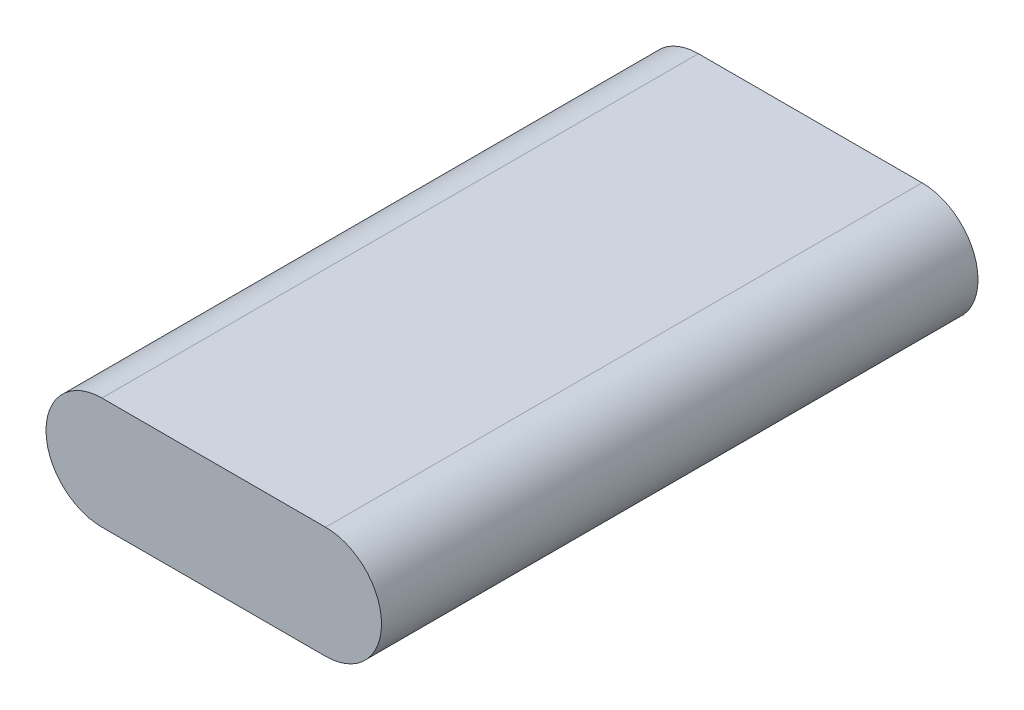
ISO-10303-21;
HEADER;
FILE_DESCRIPTION(('STEP AP214'),'2;1');
FILE_NAME('part.step','',(''),(''),'','','');
FILE_SCHEMA(('AUTOMOTIVE_DESIGN { 1 0 10303 214 1 1 1 1 }'));
ENDSEC;
DATA;
#1=APPLICATION_CONTEXT('core data for automotive mechanical design processes');
#2=APPLICATION_PROTOCOL_DEFINITION('international standard','automotive_design',2000,#1);
#3=PRODUCT_CONTEXT('',#1,'mechanical');
#4=PRODUCT('Part','Part','',(#3));
#5=PRODUCT_RELATED_PRODUCT_CATEGORY('part','',(#4));
#6=PRODUCT_DEFINITION_FORMATION('','',#4);
#7=PRODUCT_DEFINITION_CONTEXT('part definition',#1,'design');
#8=PRODUCT_DEFINITION('design','',#6,#7);
#9=PRODUCT_DEFINITION_SHAPE('','',#8);
#10=(LENGTH_UNIT() NAMED_UNIT(*) SI_UNIT(.MILLI.,.METRE.));
#11=(NAMED_UNIT(*) PLANE_ANGLE_UNIT() SI_UNIT($,.RADIAN.));
#12=(NAMED_UNIT(*) SI_UNIT($,.STERADIAN.) SOLID_ANGLE_UNIT());
#13=UNCERTAINTY_MEASURE_WITH_UNIT(LENGTH_MEASURE(1.E-05),#10,'distance_accuracy_value','');
#14=(GEOMETRIC_REPRESENTATION_CONTEXT(3) GLOBAL_UNCERTAINTY_ASSIGNED_CONTEXT((#13)) GLOBAL_UNIT_ASSIGNED_CONTEXT((#10,
#11,#12)) REPRESENTATION_CONTEXT('',''));
#15=CARTESIAN_POINT('',(0.,0.,0.));
#16=DIRECTION('',(0.,0.,1.));
#17=DIRECTION('',(1.,0.,0.));
#18=AXIS2_PLACEMENT_3D('',#15,#16,#17);
#19=CARTESIAN_POINT('',(0.,0.,80.));
#20=DIRECTION('',(0.,0.,-1.));
#21=DIRECTION('',(-1.,0.,0.));
#22=AXIS2_PLACEMENT_3D('',#19,#20,#21);
#23=CYLINDRICAL_SURFACE('',#22,7.5);
#24=CARTESIAN_POINT('',(0.,0.,0.));
#25=DIRECTION('',(0.,0.,1.));
#26=DIRECTION('',(1.,0.,0.));
#27=AXIS2_PLACEMENT_3D('',#24,#25,#26);
#28=CIRCLE('',#27,7.5);
#29=CARTESIAN_POINT('',(0.,7.5,0.));
#30=VERTEX_POINT('',#29);
#31=CARTESIAN_POINT('',(0.,-7.5,0.));
#32=VERTEX_POINT('',#31);
#33=EDGE_CURVE('E95',#30,#32,#28,.T.);
#34=ORIENTED_EDGE('',*,*,#33,.T.);
#35=DIRECTION('',(0.,0.,-1.));
#36=VECTOR('',#35,1.);
#37=CARTESIAN_POINT('',(0.,-7.5,80.));
#38=LINE('',#37,#36);
#39=CARTESIAN_POINT('',(0.,-7.5,80.));
#40=VERTEX_POINT('',#39);
#41=EDGE_CURVE('E11',#40,#32,#38,.T.);
#42=ORIENTED_EDGE('',*,*,#41,.F.);
#43=CARTESIAN_POINT('',(0.,0.,80.));
#44=DIRECTION('',(0.,0.,1.));
#45=DIRECTION('',(1.,0.,0.));
#46=AXIS2_PLACEMENT_3D('',#43,#44,#45);
#47=CIRCLE('',#46,7.5);
#48=CARTESIAN_POINT('',(0.,7.5,80.));
#49=VERTEX_POINT('',#48);
#50=EDGE_CURVE('E83',#49,#40,#47,.T.);
#51=ORIENTED_EDGE('',*,*,#50,.F.);
#52=DIRECTION('',(0.,0.,-1.));
#53=VECTOR('',#52,1.);
#54=CARTESIAN_POINT('',(0.,7.5,80.));
#55=LINE('',#54,#53);
#56=EDGE_CURVE('E91',#49,#30,#55,.T.);
#57=ORIENTED_EDGE('',*,*,#56,.T.);
#58=EDGE_LOOP('',(#34,#42,#51,#57));
#59=FACE_BOUND('',#58,.T.);
#60=ADVANCED_FACE('F32',(#59),#23,.T.);
#61=CARTESIAN_POINT('',(0.,-7.5,80.));
#62=DIRECTION('',(0.,1.,0.));
#63=DIRECTION('',(0.,0.,1.));
#64=AXIS2_PLACEMENT_3D('',#61,#62,#63);
#65=PLANE('',#64);
#66=DIRECTION('',(1.,0.,0.));
#67=VECTOR('',#66,1.);
#68=CARTESIAN_POINT('',(0.,-7.5,0.));
#69=LINE('',#68,#67);
#70=CARTESIAN_POINT('',(30.,-7.5,0.));
#71=VERTEX_POINT('',#70);
#72=EDGE_CURVE('E87',#32,#71,#69,.T.);
#73=ORIENTED_EDGE('',*,*,#72,.T.);
#74=DIRECTION('',(0.,0.,-1.));
#75=VECTOR('',#74,1.);
#76=CARTESIAN_POINT('',(30.,-7.5,80.));
#77=LINE('',#76,#75);
#78=CARTESIAN_POINT('',(30.,-7.5,80.));
#79=VERTEX_POINT('',#78);
#80=EDGE_CURVE('E40',#79,#71,#77,.T.);
#81=ORIENTED_EDGE('',*,*,#80,.F.);
#82=DIRECTION('',(1.,0.,0.));
#83=VECTOR('',#82,1.);
#84=CARTESIAN_POINT('',(0.,-7.5,80.));
#85=LINE('',#84,#83);
#86=EDGE_CURVE('E78',#40,#79,#85,.T.);
#87=ORIENTED_EDGE('',*,*,#86,.F.);
#88=ORIENTED_EDGE('',*,*,#41,.T.);
#89=EDGE_LOOP('',(#73,#81,#87,#88));
#90=FACE_BOUND('',#89,.T.);
#91=ADVANCED_FACE('F86',(#90),#65,.F.);
#92=CARTESIAN_POINT('',(30.,0.,80.));
#93=DIRECTION('',(0.,0.,-1.));
#94=DIRECTION('',(-1.,0.,0.));
#95=AXIS2_PLACEMENT_3D('',#92,#93,#94);
#96=CYLINDRICAL_SURFACE('',#95,7.5);
#97=CARTESIAN_POINT('',(30.,0.,0.));
#98=DIRECTION('',(0.,0.,1.));
#99=DIRECTION('',(1.,0.,0.));
#100=AXIS2_PLACEMENT_3D('',#97,#98,#99);
#101=CIRCLE('',#100,7.5);
#102=CARTESIAN_POINT('',(30.,7.5,0.));
#103=VERTEX_POINT('',#102);
#104=EDGE_CURVE('E65',#71,#103,#101,.T.);
#105=ORIENTED_EDGE('',*,*,#104,.T.);
#106=DIRECTION('',(0.,0.,-1.));
#107=VECTOR('',#106,1.);
#108=CARTESIAN_POINT('',(30.,7.5,80.));
#109=LINE('',#108,#107);
#110=CARTESIAN_POINT('',(30.,7.5,80.));
#111=VERTEX_POINT('',#110);
#112=EDGE_CURVE('E88',#111,#103,#109,.T.);
#113=ORIENTED_EDGE('',*,*,#112,.F.);
#114=CARTESIAN_POINT('',(30.,0.,80.));
#115=DIRECTION('',(0.,0.,1.));
#116=DIRECTION('',(1.,0.,0.));
#117=AXIS2_PLACEMENT_3D('',#114,#115,#116);
#118=CIRCLE('',#117,7.5);
#119=EDGE_CURVE('E81',#79,#111,#118,.T.);
#120=ORIENTED_EDGE('',*,*,#119,.F.);
#121=ORIENTED_EDGE('',*,*,#80,.T.);
#122=EDGE_LOOP('',(#105,#113,#120,#121));
#123=FACE_BOUND('',#122,.T.);
#124=ADVANCED_FACE('F89',(#123),#96,.T.);
#125=CARTESIAN_POINT('',(0.,7.5,80.));
#126=DIRECTION('',(0.,-1.,0.));
#127=DIRECTION('',(0.,0.,-1.));
#128=AXIS2_PLACEMENT_3D('',#125,#126,#127);
#129=PLANE('',#128);
#130=DIRECTION('',(-1.,0.,0.));
#131=VECTOR('',#130,1.);
#132=CARTESIAN_POINT('',(0.,7.5,0.));
#133=LINE('',#132,#131);
#134=EDGE_CURVE('E71',#103,#30,#133,.T.);
#135=ORIENTED_EDGE('',*,*,#134,.T.);
#136=ORIENTED_EDGE('',*,*,#56,.F.);
#137=DIRECTION('',(-1.,0.,0.));
#138=VECTOR('',#137,1.);
#139=CARTESIAN_POINT('',(0.,7.5,80.));
#140=LINE('',#139,#138);
#141=EDGE_CURVE('E48',#111,#49,#140,.T.);
#142=ORIENTED_EDGE('',*,*,#141,.F.);
#143=ORIENTED_EDGE('',*,*,#112,.T.);
#144=EDGE_LOOP('',(#135,#136,#142,#143));
#145=FACE_BOUND('',#144,.T.);
#146=ADVANCED_FACE('F102',(#145),#129,.F.);
#147=CARTESIAN_POINT('',(0.,0.,80.));
#148=DIRECTION('',(0.,0.,1.));
#149=DIRECTION('',(1.,0.,0.));
#150=AXIS2_PLACEMENT_3D('',#147,#148,#149);
#151=PLANE('',#150);
#152=ORIENTED_EDGE('',*,*,#50,.T.);
#153=ORIENTED_EDGE('',*,*,#86,.T.);
#154=ORIENTED_EDGE('',*,*,#119,.T.);
#155=ORIENTED_EDGE('',*,*,#141,.T.);
#156=EDGE_LOOP('',(#152,#153,#154,#155));
#157=FACE_BOUND('',#156,.T.);
#158=ADVANCED_FACE('F79',(#157),#151,.T.);
#159=CARTESIAN_POINT('',(0.,0.,0.));
#160=DIRECTION('',(0.,0.,1.));
#161=DIRECTION('',(1.,0.,0.));
#162=AXIS2_PLACEMENT_3D('',#159,#160,#161);
#163=PLANE('',#162);
#164=ORIENTED_EDGE('',*,*,#33,.F.);
#165=ORIENTED_EDGE('',*,*,#134,.F.);
#166=ORIENTED_EDGE('',*,*,#104,.F.);
#167=ORIENTED_EDGE('',*,*,#72,.F.);
#168=EDGE_LOOP('',(#164,#165,#166,#167));
#169=FACE_BOUND('',#168,.T.);
#170=ADVANCED_FACE('F105',(#169),#163,.F.);
#171=CLOSED_SHELL('',(#60,#91,#124,#146,#158,#170));
#172=MANIFOLD_SOLID_BREP('B2',#171);
#173=ADVANCED_BREP_SHAPE_REPRESENTATION('',(#18,#172),#14);
#174=SHAPE_DEFINITION_REPRESENTATION(#9,#173);
ENDSEC;
END-ISO-10303-21;
